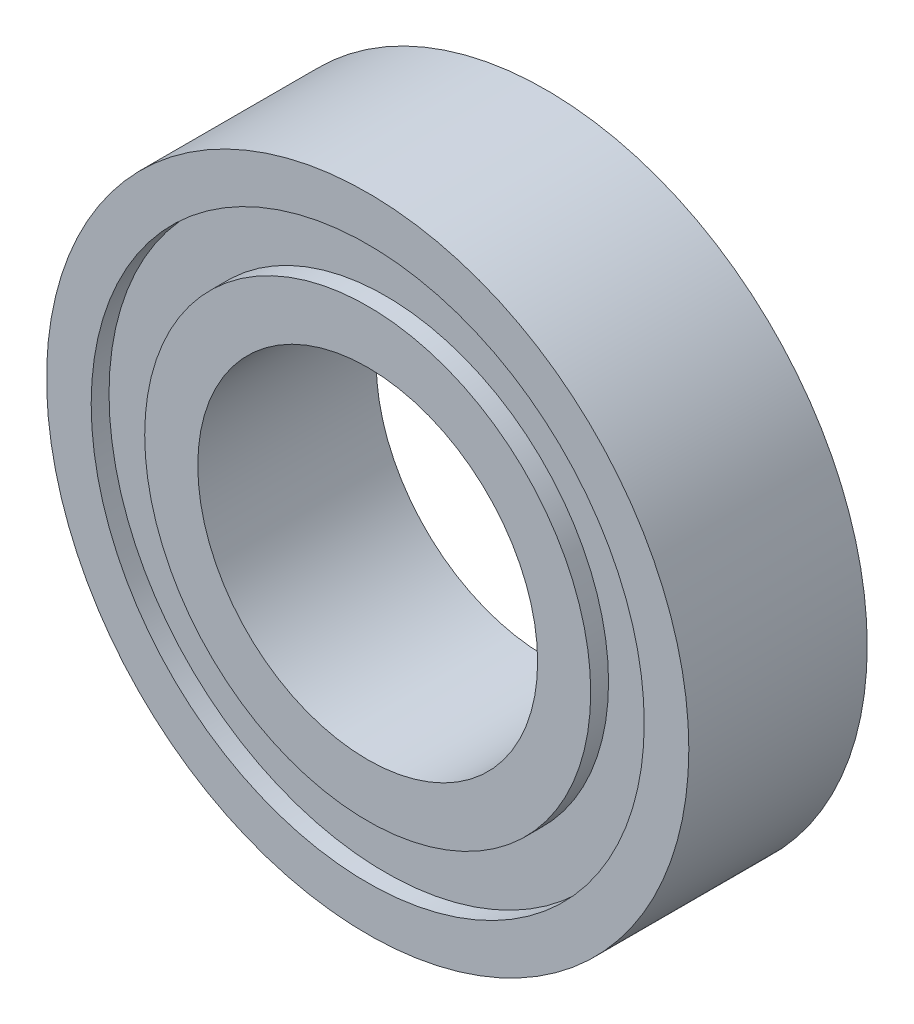
ISO-10303-21;
HEADER;
FILE_DESCRIPTION(('STEP AP214'),'2;1');
FILE_NAME('part.step','',(''),(''),'','','');
FILE_SCHEMA(('AUTOMOTIVE_DESIGN { 1 0 10303 214 1 1 1 1 }'));
ENDSEC;
DATA;
#1=APPLICATION_CONTEXT('core data for automotive mechanical design processes');
#2=APPLICATION_PROTOCOL_DEFINITION('international standard','automotive_design',2000,#1);
#3=PRODUCT_CONTEXT('',#1,'mechanical');
#4=PRODUCT('Part','Part','',(#3));
#5=PRODUCT_RELATED_PRODUCT_CATEGORY('part','',(#4));
#6=PRODUCT_DEFINITION_FORMATION('','',#4);
#7=PRODUCT_DEFINITION_CONTEXT('part definition',#1,'design');
#8=PRODUCT_DEFINITION('design','',#6,#7);
#9=PRODUCT_DEFINITION_SHAPE('','',#8);
#10=(LENGTH_UNIT() NAMED_UNIT(*) SI_UNIT(.MILLI.,.METRE.));
#11=(NAMED_UNIT(*) PLANE_ANGLE_UNIT() SI_UNIT($,.RADIAN.));
#12=(NAMED_UNIT(*) SI_UNIT($,.STERADIAN.) SOLID_ANGLE_UNIT());
#13=UNCERTAINTY_MEASURE_WITH_UNIT(LENGTH_MEASURE(1.E-05),#10,'distance_accuracy_value','');
#14=(GEOMETRIC_REPRESENTATION_CONTEXT(3) GLOBAL_UNCERTAINTY_ASSIGNED_CONTEXT((#13)) GLOBAL_UNIT_ASSIGNED_CONTEXT((#10,
#11,#12)) REPRESENTATION_CONTEXT('',''));
#15=CARTESIAN_POINT('',(0.,0.,0.));
#16=DIRECTION('',(0.,0.,1.));
#17=DIRECTION('',(1.,0.,0.));
#18=AXIS2_PLACEMENT_3D('',#15,#16,#17);
#19=CARTESIAN_POINT('',(0.,0.,5.));
#20=DIRECTION('',(0.,0.,1.));
#21=DIRECTION('',(1.,0.,0.));
#22=AXIS2_PLACEMENT_3D('',#19,#20,#21);
#23=PLANE('',#22);
#24=CARTESIAN_POINT('',(0.,0.,5.));
#25=DIRECTION('',(0.,0.,1.));
#26=DIRECTION('',(1.,0.,0.));
#27=AXIS2_PLACEMENT_3D('',#24,#25,#26);
#28=CIRCLE('',#27,9.);
#29=CARTESIAN_POINT('',(9.,0.,5.));
#30=VERTEX_POINT('',#29);
#31=EDGE_CURVE('E10',#30,#30,#28,.T.);
#32=ORIENTED_EDGE('',*,*,#31,.T.);
#33=EDGE_LOOP('',(#32));
#34=FACE_BOUND('',#33,.T.);
#35=CARTESIAN_POINT('',(0.,0.,5.));
#36=DIRECTION('',(0.,0.,-1.));
#37=DIRECTION('',(-1.,0.,0.));
#38=AXIS2_PLACEMENT_3D('',#35,#36,#37);
#39=CIRCLE('',#38,7.75);
#40=CARTESIAN_POINT('',(-7.75,0.,5.));
#41=VERTEX_POINT('',#40);
#42=EDGE_CURVE('E62',#41,#41,#39,.T.);
#43=ORIENTED_EDGE('',*,*,#42,.T.);
#44=EDGE_LOOP('',(#43));
#45=FACE_BOUND('',#44,.T.);
#46=ADVANCED_FACE('F31',(#34,#45),#23,.T.);
#47=CARTESIAN_POINT('',(0.,0.,0.));
#48=DIRECTION('',(0.,0.,1.));
#49=DIRECTION('',(1.,0.,0.));
#50=AXIS2_PLACEMENT_3D('',#47,#48,#49);
#51=PLANE('',#50);
#52=CARTESIAN_POINT('',(0.,0.,0.));
#53=DIRECTION('',(0.,0.,1.));
#54=DIRECTION('',(1.,0.,0.));
#55=AXIS2_PLACEMENT_3D('',#52,#53,#54);
#56=CIRCLE('',#55,4.7625);
#57=CARTESIAN_POINT('',(4.7625,0.,0.));
#58=VERTEX_POINT('',#57);
#59=EDGE_CURVE('E44',#58,#58,#56,.T.);
#60=ORIENTED_EDGE('',*,*,#59,.T.);
#61=EDGE_LOOP('',(#60));
#62=FACE_BOUND('',#61,.T.);
#63=CARTESIAN_POINT('',(0.,0.,0.));
#64=DIRECTION('',(0.,0.,-1.));
#65=DIRECTION('',(-1.,0.,0.));
#66=AXIS2_PLACEMENT_3D('',#63,#64,#65);
#67=CIRCLE('',#66,6.25);
#68=CARTESIAN_POINT('',(-6.25,0.,0.));
#69=VERTEX_POINT('',#68);
#70=EDGE_CURVE('E56',#69,#69,#67,.T.);
#71=ORIENTED_EDGE('',*,*,#70,.T.);
#72=EDGE_LOOP('',(#71));
#73=FACE_BOUND('',#72,.T.);
#74=ADVANCED_FACE('F87',(#62,#73),#51,.F.);
#75=CARTESIAN_POINT('',(0.,0.,5.));
#76=DIRECTION('',(0.,0.,-1.));
#77=DIRECTION('',(-1.,0.,0.));
#78=AXIS2_PLACEMENT_3D('',#75,#76,#77);
#79=CIRCLE('',#78,6.25);
#80=CARTESIAN_POINT('',(-6.25,0.,5.));
#81=VERTEX_POINT('',#80);
#82=EDGE_CURVE('E68',#81,#81,#79,.T.);
#83=ORIENTED_EDGE('',*,*,#82,.F.);
#84=EDGE_LOOP('',(#83));
#85=FACE_BOUND('',#84,.T.);
#86=CARTESIAN_POINT('',(0.,0.,5.));
#87=DIRECTION('',(0.,0.,1.));
#88=DIRECTION('',(1.,0.,0.));
#89=AXIS2_PLACEMENT_3D('',#86,#87,#88);
#90=CIRCLE('',#89,4.7625);
#91=CARTESIAN_POINT('',(4.7625,0.,5.));
#92=VERTEX_POINT('',#91);
#93=EDGE_CURVE('E42',#92,#92,#90,.T.);
#94=ORIENTED_EDGE('',*,*,#93,.F.);
#95=EDGE_LOOP('',(#94));
#96=FACE_BOUND('',#95,.T.);
#97=ADVANCED_FACE('F83',(#85,#96),#23,.T.);
#98=CARTESIAN_POINT('',(0.,0.,0.));
#99=DIRECTION('',(0.,0.,-1.));
#100=DIRECTION('',(-1.,0.,0.));
#101=AXIS2_PLACEMENT_3D('',#98,#99,#100);
#102=CIRCLE('',#101,7.75);
#103=CARTESIAN_POINT('',(-7.75,0.,0.));
#104=VERTEX_POINT('',#103);
#105=EDGE_CURVE('E50',#104,#104,#102,.T.);
#106=ORIENTED_EDGE('',*,*,#105,.F.);
#107=EDGE_LOOP('',(#106));
#108=FACE_BOUND('',#107,.T.);
#109=CARTESIAN_POINT('',(0.,0.,0.));
#110=DIRECTION('',(0.,0.,1.));
#111=DIRECTION('',(1.,0.,0.));
#112=AXIS2_PLACEMENT_3D('',#109,#110,#111);
#113=CIRCLE('',#112,9.);
#114=CARTESIAN_POINT('',(9.,0.,0.));
#115=VERTEX_POINT('',#114);
#116=EDGE_CURVE('E35',#115,#115,#113,.T.);
#117=ORIENTED_EDGE('',*,*,#116,.F.);
#118=EDGE_LOOP('',(#117));
#119=FACE_BOUND('',#118,.T.);
#120=ADVANCED_FACE('F86',(#108,#119),#51,.F.);
#121=CARTESIAN_POINT('',(0.,0.,5.));
#122=DIRECTION('',(0.,0.,-1.));
#123=DIRECTION('',(-1.,0.,0.));
#124=AXIS2_PLACEMENT_3D('',#121,#122,#123);
#125=CYLINDRICAL_SURFACE('',#124,9.);
#126=ORIENTED_EDGE('',*,*,#31,.F.);
#127=EDGE_LOOP('',(#126));
#128=FACE_BOUND('',#127,.T.);
#129=ORIENTED_EDGE('',*,*,#116,.T.);
#130=EDGE_LOOP('',(#129));
#131=FACE_BOUND('',#130,.T.);
#132=ADVANCED_FACE('F33',(#128,#131),#125,.T.);
#133=CARTESIAN_POINT('',(0.,0.,5.));
#134=DIRECTION('',(0.,0.,-1.));
#135=DIRECTION('',(-1.,0.,0.));
#136=AXIS2_PLACEMENT_3D('',#133,#134,#135);
#137=CYLINDRICAL_SURFACE('',#136,4.7625);
#138=ORIENTED_EDGE('',*,*,#93,.T.);
#139=EDGE_LOOP('',(#138));
#140=FACE_BOUND('',#139,.T.);
#141=ORIENTED_EDGE('',*,*,#59,.F.);
#142=EDGE_LOOP('',(#141));
#143=FACE_BOUND('',#142,.T.);
#144=ADVANCED_FACE('F91',(#140,#143),#137,.F.);
#145=CARTESIAN_POINT('',(0.,0.,0.5));
#146=DIRECTION('',(0.,0.,-1.));
#147=DIRECTION('',(-1.,0.,0.));
#148=AXIS2_PLACEMENT_3D('',#145,#146,#147);
#149=CYLINDRICAL_SURFACE('',#148,7.75);
#150=CARTESIAN_POINT('',(0.,0.,0.5));
#151=DIRECTION('',(0.,0.,-1.));
#152=DIRECTION('',(-1.,0.,0.));
#153=AXIS2_PLACEMENT_3D('',#150,#151,#152);
#154=CIRCLE('',#153,7.75);
#155=CARTESIAN_POINT('',(-7.75,0.,0.5));
#156=VERTEX_POINT('',#155);
#157=EDGE_CURVE('E47',#156,#156,#154,.T.);
#158=ORIENTED_EDGE('',*,*,#157,.F.);
#159=EDGE_LOOP('',(#158));
#160=FACE_BOUND('',#159,.T.);
#161=ORIENTED_EDGE('',*,*,#105,.T.);
#162=EDGE_LOOP('',(#161));
#163=FACE_BOUND('',#162,.T.);
#164=ADVANCED_FACE('F94',(#160,#163),#149,.F.);
#165=CARTESIAN_POINT('',(0.,0.,0.5));
#166=DIRECTION('',(0.,0.,-1.));
#167=DIRECTION('',(-1.,0.,0.));
#168=AXIS2_PLACEMENT_3D('',#165,#166,#167);
#169=PLANE('',#168);
#170=CARTESIAN_POINT('',(0.,0.,0.5));
#171=DIRECTION('',(0.,0.,-1.));
#172=DIRECTION('',(-1.,0.,0.));
#173=AXIS2_PLACEMENT_3D('',#170,#171,#172);
#174=CIRCLE('',#173,6.25);
#175=CARTESIAN_POINT('',(-6.25,0.,0.5));
#176=VERTEX_POINT('',#175);
#177=EDGE_CURVE('E53',#176,#176,#174,.T.);
#178=ORIENTED_EDGE('',*,*,#177,.F.);
#179=EDGE_LOOP('',(#178));
#180=FACE_BOUND('',#179,.T.);
#181=ORIENTED_EDGE('',*,*,#157,.T.);
#182=EDGE_LOOP('',(#181));
#183=FACE_BOUND('',#182,.T.);
#184=ADVANCED_FACE('F104',(#180,#183),#169,.T.);
#185=CARTESIAN_POINT('',(0.,0.,0.5));
#186=DIRECTION('',(0.,0.,-1.));
#187=DIRECTION('',(-1.,0.,0.));
#188=AXIS2_PLACEMENT_3D('',#185,#186,#187);
#189=CYLINDRICAL_SURFACE('',#188,6.25);
#190=ORIENTED_EDGE('',*,*,#177,.T.);
#191=EDGE_LOOP('',(#190));
#192=FACE_BOUND('',#191,.T.);
#193=ORIENTED_EDGE('',*,*,#70,.F.);
#194=EDGE_LOOP('',(#193));
#195=FACE_BOUND('',#194,.T.);
#196=ADVANCED_FACE('F102',(#192,#195),#189,.T.);
#197=CARTESIAN_POINT('',(0.,0.,4.5));
#198=DIRECTION('',(0.,0.,1.));
#199=DIRECTION('',(-1.,0.,0.));
#200=AXIS2_PLACEMENT_3D('',#197,#198,#199);
#201=PLANE('',#200);
#202=CARTESIAN_POINT('',(0.,0.,4.5));
#203=DIRECTION('',(0.,0.,-1.));
#204=DIRECTION('',(-1.,0.,0.));
#205=AXIS2_PLACEMENT_3D('',#202,#203,#204);
#206=CIRCLE('',#205,7.75);
#207=CARTESIAN_POINT('',(-7.75,0.,4.5));
#208=VERTEX_POINT('',#207);
#209=EDGE_CURVE('E59',#208,#208,#206,.T.);
#210=ORIENTED_EDGE('',*,*,#209,.F.);
#211=EDGE_LOOP('',(#210));
#212=FACE_BOUND('',#211,.T.);
#213=CARTESIAN_POINT('',(0.,0.,4.5));
#214=DIRECTION('',(0.,0.,-1.));
#215=DIRECTION('',(-1.,0.,0.));
#216=AXIS2_PLACEMENT_3D('',#213,#214,#215);
#217=CIRCLE('',#216,6.25);
#218=CARTESIAN_POINT('',(-6.25,0.,4.5));
#219=VERTEX_POINT('',#218);
#220=EDGE_CURVE('E65',#219,#219,#217,.T.);
#221=ORIENTED_EDGE('',*,*,#220,.T.);
#222=EDGE_LOOP('',(#221));
#223=FACE_BOUND('',#222,.T.);
#224=ADVANCED_FACE('F74',(#212,#223),#201,.T.);
#225=CARTESIAN_POINT('',(0.,0.,4.5));
#226=DIRECTION('',(0.,0.,1.));
#227=DIRECTION('',(1.,0.,0.));
#228=AXIS2_PLACEMENT_3D('',#225,#226,#227);
#229=CYLINDRICAL_SURFACE('',#228,7.75);
#230=ORIENTED_EDGE('',*,*,#209,.T.);
#231=EDGE_LOOP('',(#230));
#232=FACE_BOUND('',#231,.T.);
#233=ORIENTED_EDGE('',*,*,#42,.F.);
#234=EDGE_LOOP('',(#233));
#235=FACE_BOUND('',#234,.T.);
#236=ADVANCED_FACE('F79',(#232,#235),#229,.F.);
#237=CARTESIAN_POINT('',(0.,0.,4.5));
#238=DIRECTION('',(0.,0.,1.));
#239=DIRECTION('',(1.,0.,0.));
#240=AXIS2_PLACEMENT_3D('',#237,#238,#239);
#241=CYLINDRICAL_SURFACE('',#240,6.25);
#242=ORIENTED_EDGE('',*,*,#220,.F.);
#243=EDGE_LOOP('',(#242));
#244=FACE_BOUND('',#243,.T.);
#245=ORIENTED_EDGE('',*,*,#82,.T.);
#246=EDGE_LOOP('',(#245));
#247=FACE_BOUND('',#246,.T.);
#248=ADVANCED_FACE('F76',(#244,#247),#241,.T.);
#249=CLOSED_SHELL('',(#46,#74,#97,#120,#132,#144,#164,#184,#196,#224,#236,#248));
#250=MANIFOLD_SOLID_BREP('B2',#249);
#251=ADVANCED_BREP_SHAPE_REPRESENTATION('',(#18,#250),#14);
#252=SHAPE_DEFINITION_REPRESENTATION(#9,#251);
ENDSEC;
END-ISO-10303-21;
